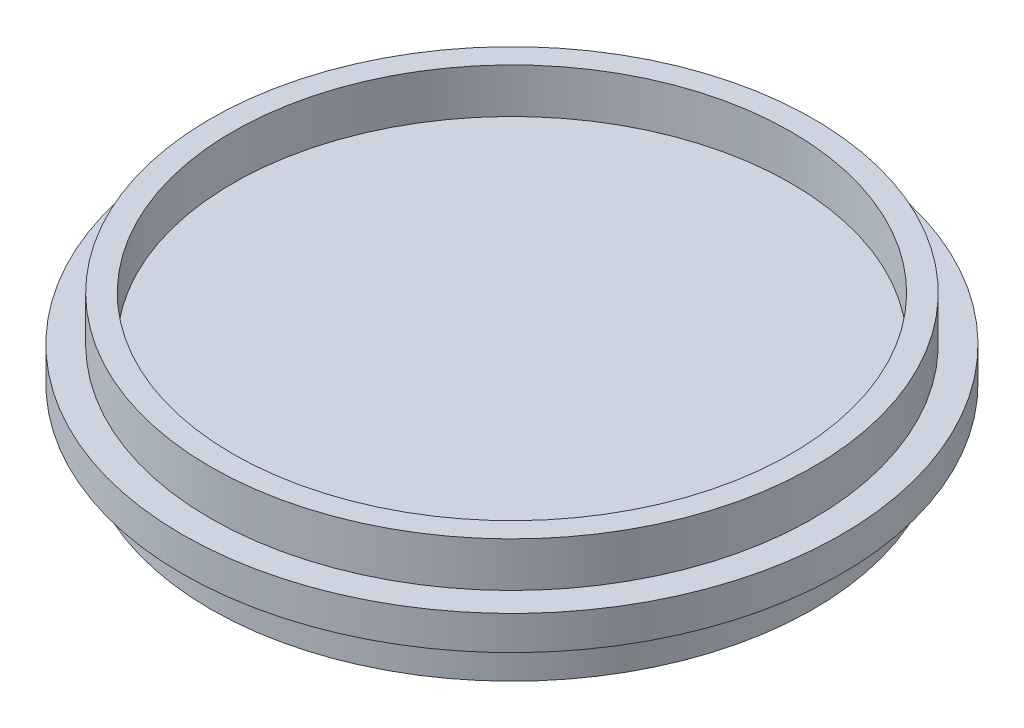
ISO-10303-21;
HEADER;
FILE_DESCRIPTION(('STEP AP214'),'2;1');
FILE_NAME('part.step','',(''),(''),'','','');
FILE_SCHEMA(('AUTOMOTIVE_DESIGN { 1 0 10303 214 1 1 1 1 }'));
ENDSEC;
DATA;
#1=APPLICATION_CONTEXT('core data for automotive mechanical design processes');
#2=APPLICATION_PROTOCOL_DEFINITION('international standard','automotive_design',2000,#1);
#3=PRODUCT_CONTEXT('',#1,'mechanical');
#4=PRODUCT('Part','Part','',(#3));
#5=PRODUCT_RELATED_PRODUCT_CATEGORY('part','',(#4));
#6=PRODUCT_DEFINITION_FORMATION('','',#4);
#7=PRODUCT_DEFINITION_CONTEXT('part definition',#1,'design');
#8=PRODUCT_DEFINITION('design','',#6,#7);
#9=PRODUCT_DEFINITION_SHAPE('','',#8);
#10=(LENGTH_UNIT() NAMED_UNIT(*) SI_UNIT(.MILLI.,.METRE.));
#11=(NAMED_UNIT(*) PLANE_ANGLE_UNIT() SI_UNIT($,.RADIAN.));
#12=(NAMED_UNIT(*) SI_UNIT($,.STERADIAN.) SOLID_ANGLE_UNIT());
#13=UNCERTAINTY_MEASURE_WITH_UNIT(LENGTH_MEASURE(1.E-05),#10,'distance_accuracy_value','');
#14=(GEOMETRIC_REPRESENTATION_CONTEXT(3) GLOBAL_UNCERTAINTY_ASSIGNED_CONTEXT((#13)) GLOBAL_UNIT_ASSIGNED_CONTEXT((#10,
#11,#12)) REPRESENTATION_CONTEXT('',''));
#15=CARTESIAN_POINT('',(0.,0.,0.));
#16=DIRECTION('',(0.,0.,1.));
#17=DIRECTION('',(1.,0.,0.));
#18=AXIS2_PLACEMENT_3D('',#15,#16,#17);
#19=CARTESIAN_POINT('',(0.,4.826,0.));
#20=DIRECTION('',(0.,-1.,0.));
#21=DIRECTION('',(0.,0.,-1.));
#22=AXIS2_PLACEMENT_3D('',#19,#20,#21);
#23=CYLINDRICAL_SURFACE('',#22,93.726);
#24=CARTESIAN_POINT('',(0.,4.826,0.));
#25=DIRECTION('',(0.,1.,0.));
#26=DIRECTION('',(0.,0.,1.));
#27=AXIS2_PLACEMENT_3D('',#24,#25,#26);
#28=CIRCLE('',#27,93.726);
#29=CARTESIAN_POINT('',(0.,4.826,93.726));
#30=VERTEX_POINT('',#29);
#31=EDGE_CURVE('E49',#30,#30,#28,.T.);
#32=ORIENTED_EDGE('',*,*,#31,.F.);
#33=EDGE_LOOP('',(#32));
#34=FACE_BOUND('',#33,.T.);
#35=CARTESIAN_POINT('',(0.,-4.826,0.));
#36=DIRECTION('',(0.,1.,0.));
#37=DIRECTION('',(0.,0.,1.));
#38=AXIS2_PLACEMENT_3D('',#35,#36,#37);
#39=CIRCLE('',#38,93.726);
#40=CARTESIAN_POINT('',(0.,-4.826,93.726));
#41=VERTEX_POINT('',#40);
#42=EDGE_CURVE('E54',#41,#41,#39,.T.);
#43=ORIENTED_EDGE('',*,*,#42,.T.);
#44=EDGE_LOOP('',(#43));
#45=FACE_BOUND('',#44,.T.);
#46=ADVANCED_FACE('F37',(#34,#45),#23,.T.);
#47=CARTESIAN_POINT('',(0.,4.826,0.));
#48=DIRECTION('',(0.,1.,0.));
#49=DIRECTION('',(0.,0.,1.));
#50=AXIS2_PLACEMENT_3D('',#47,#48,#49);
#51=PLANE('',#50);
#52=CARTESIAN_POINT('',(0.,4.826,0.));
#53=DIRECTION('',(0.,1.,0.));
#54=DIRECTION('',(0.,0.,1.));
#55=AXIS2_PLACEMENT_3D('',#52,#53,#54);
#56=CIRCLE('',#55,85.725);
#57=CARTESIAN_POINT('',(0.,4.826,85.725));
#58=VERTEX_POINT('',#57);
#59=EDGE_CURVE('E61',#58,#58,#56,.T.);
#60=ORIENTED_EDGE('',*,*,#59,.F.);
#61=EDGE_LOOP('',(#60));
#62=FACE_BOUND('',#61,.T.);
#63=ORIENTED_EDGE('',*,*,#31,.T.);
#64=EDGE_LOOP('',(#63));
#65=FACE_BOUND('',#64,.T.);
#66=ADVANCED_FACE('F101',(#62,#65),#51,.T.);
#67=CARTESIAN_POINT('',(0.,-4.826,0.));
#68=DIRECTION('',(0.,1.,0.));
#69=DIRECTION('',(0.,0.,1.));
#70=AXIS2_PLACEMENT_3D('',#67,#68,#69);
#71=PLANE('',#70);
#72=CARTESIAN_POINT('',(0.,-4.826,0.));
#73=DIRECTION('',(0.,1.,0.));
#74=DIRECTION('',(0.,0.,1.));
#75=AXIS2_PLACEMENT_3D('',#72,#73,#74);
#76=CIRCLE('',#75,85.725);
#77=CARTESIAN_POINT('',(0.,-4.826,85.725));
#78=VERTEX_POINT('',#77);
#79=EDGE_CURVE('E73',#78,#78,#76,.T.);
#80=ORIENTED_EDGE('',*,*,#79,.T.);
#81=EDGE_LOOP('',(#80));
#82=FACE_BOUND('',#81,.T.);
#83=ORIENTED_EDGE('',*,*,#42,.F.);
#84=EDGE_LOOP('',(#83));
#85=FACE_BOUND('',#84,.T.);
#86=ADVANCED_FACE('F97',(#82,#85),#71,.F.);
#87=CARTESIAN_POINT('',(0.,17.526,0.));
#88=DIRECTION('',(0.,1.,0.));
#89=DIRECTION('',(0.,0.,1.));
#90=AXIS2_PLACEMENT_3D('',#87,#88,#89);
#91=PLANE('',#90);
#92=CARTESIAN_POINT('',(0.,17.526,0.));
#93=DIRECTION('',(0.,1.,0.));
#94=DIRECTION('',(0.,0.,1.));
#95=AXIS2_PLACEMENT_3D('',#92,#93,#94);
#96=CIRCLE('',#95,85.725);
#97=CARTESIAN_POINT('',(0.,17.526,85.725));
#98=VERTEX_POINT('',#97);
#99=EDGE_CURVE('E59',#98,#98,#96,.T.);
#100=ORIENTED_EDGE('',*,*,#99,.T.);
#101=EDGE_LOOP('',(#100));
#102=FACE_BOUND('',#101,.T.);
#103=CARTESIAN_POINT('',(0.,17.526,0.));
#104=DIRECTION('',(0.,1.,0.));
#105=DIRECTION('',(0.,0.,1.));
#106=AXIS2_PLACEMENT_3D('',#103,#104,#105);
#107=CIRCLE('',#106,79.375);
#108=CARTESIAN_POINT('',(0.,17.526,79.375));
#109=VERTEX_POINT('',#108);
#110=EDGE_CURVE('E65',#109,#109,#107,.T.);
#111=ORIENTED_EDGE('',*,*,#110,.F.);
#112=EDGE_LOOP('',(#111));
#113=FACE_BOUND('',#112,.T.);
#114=ADVANCED_FACE('F114',(#102,#113),#91,.T.);
#115=CARTESIAN_POINT('',(0.,17.526,0.));
#116=DIRECTION('',(0.,-1.,0.));
#117=DIRECTION('',(0.,0.,-1.));
#118=AXIS2_PLACEMENT_3D('',#115,#116,#117);
#119=CYLINDRICAL_SURFACE('',#118,85.725);
#120=ORIENTED_EDGE('',*,*,#99,.F.);
#121=EDGE_LOOP('',(#120));
#122=FACE_BOUND('',#121,.T.);
#123=ORIENTED_EDGE('',*,*,#59,.T.);
#124=EDGE_LOOP('',(#123));
#125=FACE_BOUND('',#124,.T.);
#126=ADVANCED_FACE('F119',(#122,#125),#119,.T.);
#127=CARTESIAN_POINT('',(0.,17.526,0.));
#128=DIRECTION('',(0.,-1.,0.));
#129=DIRECTION('',(0.,0.,-1.));
#130=AXIS2_PLACEMENT_3D('',#127,#128,#129);
#131=CYLINDRICAL_SURFACE('',#130,79.375);
#132=ORIENTED_EDGE('',*,*,#110,.T.);
#133=EDGE_LOOP('',(#132));
#134=FACE_BOUND('',#133,.T.);
#135=CARTESIAN_POINT('',(0.,4.826,0.));
#136=DIRECTION('',(0.,1.,0.));
#137=DIRECTION('',(0.,0.,1.));
#138=AXIS2_PLACEMENT_3D('',#135,#136,#137);
#139=CIRCLE('',#138,79.375);
#140=CARTESIAN_POINT('',(0.,4.826,79.375));
#141=VERTEX_POINT('',#140);
#142=EDGE_CURVE('E44',#141,#141,#139,.F.);
#143=ORIENTED_EDGE('',*,*,#142,.T.);
#144=EDGE_LOOP('',(#143));
#145=FACE_BOUND('',#144,.T.);
#146=ADVANCED_FACE('F124',(#134,#145),#131,.F.);
#147=ORIENTED_EDGE('',*,*,#142,.F.);
#148=EDGE_LOOP('',(#147));
#149=FACE_BOUND('',#148,.T.);
#150=ADVANCED_FACE('F108',(#149),#51,.T.);
#151=CARTESIAN_POINT('',(0.,-17.526,0.));
#152=DIRECTION('',(0.,1.,0.));
#153=DIRECTION('',(0.,0.,1.));
#154=AXIS2_PLACEMENT_3D('',#151,#152,#153);
#155=CYLINDRICAL_SURFACE('',#154,85.725);
#156=CARTESIAN_POINT('',(0.,-17.526,0.));
#157=DIRECTION('',(0.,1.,0.));
#158=DIRECTION('',(0.,0.,1.));
#159=AXIS2_PLACEMENT_3D('',#156,#157,#158);
#160=CIRCLE('',#159,85.725);
#161=CARTESIAN_POINT('',(0.,-17.526,85.725));
#162=VERTEX_POINT('',#161);
#163=EDGE_CURVE('E72',#162,#162,#160,.T.);
#164=ORIENTED_EDGE('',*,*,#163,.T.);
#165=EDGE_LOOP('',(#164));
#166=FACE_BOUND('',#165,.T.);
#167=ORIENTED_EDGE('',*,*,#79,.F.);
#168=EDGE_LOOP('',(#167));
#169=FACE_BOUND('',#168,.T.);
#170=ADVANCED_FACE('F98',(#166,#169),#155,.T.);
#171=CARTESIAN_POINT('',(0.,-17.526,0.));
#172=DIRECTION('',(0.,-1.,0.));
#173=DIRECTION('',(0.,0.,1.));
#174=AXIS2_PLACEMENT_3D('',#171,#172,#173);
#175=PLANE('',#174);
#176=CARTESIAN_POINT('',(0.,-17.526,0.));
#177=DIRECTION('',(0.,1.,0.));
#178=DIRECTION('',(0.,0.,1.));
#179=AXIS2_PLACEMENT_3D('',#176,#177,#178);
#180=CIRCLE('',#179,79.375);
#181=CARTESIAN_POINT('',(0.,-17.526,79.375));
#182=VERTEX_POINT('',#181);
#183=EDGE_CURVE('E77',#182,#182,#180,.T.);
#184=ORIENTED_EDGE('',*,*,#183,.T.);
#185=EDGE_LOOP('',(#184));
#186=FACE_BOUND('',#185,.T.);
#187=ORIENTED_EDGE('',*,*,#163,.F.);
#188=EDGE_LOOP('',(#187));
#189=FACE_BOUND('',#188,.T.);
#190=ADVANCED_FACE('F85',(#186,#189),#175,.T.);
#191=CARTESIAN_POINT('',(0.,-17.526,0.));
#192=DIRECTION('',(0.,1.,0.));
#193=DIRECTION('',(0.,0.,1.));
#194=AXIS2_PLACEMENT_3D('',#191,#192,#193);
#195=CYLINDRICAL_SURFACE('',#194,79.375);
#196=ORIENTED_EDGE('',*,*,#183,.F.);
#197=EDGE_LOOP('',(#196));
#198=FACE_BOUND('',#197,.T.);
#199=CARTESIAN_POINT('',(0.,-4.826,0.));
#200=DIRECTION('',(0.,1.,0.));
#201=DIRECTION('',(0.,0.,1.));
#202=AXIS2_PLACEMENT_3D('',#199,#200,#201);
#203=CIRCLE('',#202,79.375);
#204=CARTESIAN_POINT('',(0.,-4.826,79.375));
#205=VERTEX_POINT('',#204);
#206=EDGE_CURVE('E10',#205,#205,#203,.T.);
#207=ORIENTED_EDGE('',*,*,#206,.T.);
#208=EDGE_LOOP('',(#207));
#209=FACE_BOUND('',#208,.T.);
#210=ADVANCED_FACE('F88',(#198,#209),#195,.F.);
#211=ORIENTED_EDGE('',*,*,#206,.F.);
#212=EDGE_LOOP('',(#211));
#213=FACE_BOUND('',#212,.T.);
#214=ADVANCED_FACE('F90',(#213),#71,.F.);
#215=CLOSED_SHELL('',(#46,#66,#86,#114,#126,#146,#150,#170,#190,#210,#214));
#216=MANIFOLD_SOLID_BREP('B2',#215);
#217=ADVANCED_BREP_SHAPE_REPRESENTATION('',(#18,#216),#14);
#218=SHAPE_DEFINITION_REPRESENTATION(#9,#217);
ENDSEC;
END-ISO-10303-21;
